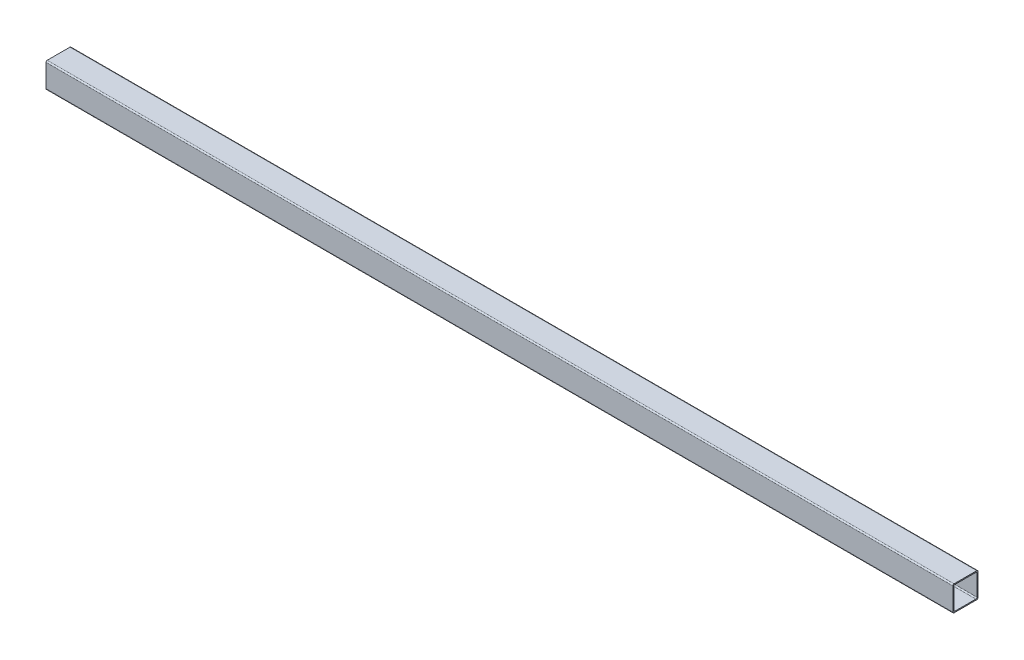
ISO-10303-21;
HEADER;
FILE_DESCRIPTION(('STEP AP214'),'2;1');
FILE_NAME('part.step','',(''),(''),'','','');
FILE_SCHEMA(('AUTOMOTIVE_DESIGN { 1 0 10303 214 1 1 1 1 }'));
ENDSEC;
DATA;
#1=APPLICATION_CONTEXT('core data for automotive mechanical design processes');
#2=APPLICATION_PROTOCOL_DEFINITION('international standard','automotive_design',2000,#1);
#3=PRODUCT_CONTEXT('',#1,'mechanical');
#4=PRODUCT('Part','Part','',(#3));
#5=PRODUCT_RELATED_PRODUCT_CATEGORY('part','',(#4));
#6=PRODUCT_DEFINITION_FORMATION('','',#4);
#7=PRODUCT_DEFINITION_CONTEXT('part definition',#1,'design');
#8=PRODUCT_DEFINITION('design','',#6,#7);
#9=PRODUCT_DEFINITION_SHAPE('','',#8);
#10=(LENGTH_UNIT() NAMED_UNIT(*) SI_UNIT(.MILLI.,.METRE.));
#11=(NAMED_UNIT(*) PLANE_ANGLE_UNIT() SI_UNIT($,.RADIAN.));
#12=(NAMED_UNIT(*) SI_UNIT($,.STERADIAN.) SOLID_ANGLE_UNIT());
#13=UNCERTAINTY_MEASURE_WITH_UNIT(LENGTH_MEASURE(1.E-05),#10,'distance_accuracy_value','');
#14=(GEOMETRIC_REPRESENTATION_CONTEXT(3) GLOBAL_UNCERTAINTY_ASSIGNED_CONTEXT((#13)) GLOBAL_UNIT_ASSIGNED_CONTEXT((#10,
#11,#12)) REPRESENTATION_CONTEXT('',''));
#15=CARTESIAN_POINT('',(0.,0.,0.));
#16=DIRECTION('',(0.,0.,1.));
#17=DIRECTION('',(1.,0.,0.));
#18=AXIS2_PLACEMENT_3D('',#15,#16,#17);
#19=CARTESIAN_POINT('',(914.4,-22.86,-22.86));
#20=DIRECTION('',(1.,0.,0.));
#21=DIRECTION('',(0.,0.,-1.));
#22=AXIS2_PLACEMENT_3D('',#19,#20,#21);
#23=PLANE('',#22);
#24=CARTESIAN_POINT('',(914.4,-22.86,-22.86));
#25=DIRECTION('',(1.,0.,0.));
#26=DIRECTION('',(0.,0.,-1.));
#27=AXIS2_PLACEMENT_3D('',#24,#25,#26);
#28=CIRCLE('',#27,2.53999999999999);
#29=CARTESIAN_POINT('',(914.4,-25.4,-22.86));
#30=VERTEX_POINT('',#29);
#31=CARTESIAN_POINT('',(914.4,-22.86,-25.4));
#32=VERTEX_POINT('',#31);
#33=EDGE_CURVE('E163',#30,#32,#28,.T.);
#34=ORIENTED_EDGE('',*,*,#33,.T.);
#35=DIRECTION('',(0.,1.,0.));
#36=VECTOR('',#35,1.);
#37=CARTESIAN_POINT('',(914.4,-22.86,-25.4));
#38=LINE('',#37,#36);
#39=CARTESIAN_POINT('',(914.4,22.86,-25.4));
#40=VERTEX_POINT('',#39);
#41=EDGE_CURVE('E246',#32,#40,#38,.T.);
#42=ORIENTED_EDGE('',*,*,#41,.T.);
#43=CARTESIAN_POINT('',(914.4,22.86,-22.86));
#44=DIRECTION('',(1.,0.,0.));
#45=DIRECTION('',(0.,0.,-1.));
#46=AXIS2_PLACEMENT_3D('',#43,#44,#45);
#47=CIRCLE('',#46,2.54);
#48=CARTESIAN_POINT('',(914.4,25.4,-22.86));
#49=VERTEX_POINT('',#48);
#50=EDGE_CURVE('E248',#40,#49,#47,.T.);
#51=ORIENTED_EDGE('',*,*,#50,.T.);
#52=DIRECTION('',(0.,0.,1.));
#53=VECTOR('',#52,1.);
#54=CARTESIAN_POINT('',(914.4,25.4,-22.86));
#55=LINE('',#54,#53);
#56=CARTESIAN_POINT('',(914.4,25.4,22.86));
#57=VERTEX_POINT('',#56);
#58=EDGE_CURVE('E250',#49,#57,#55,.T.);
#59=ORIENTED_EDGE('',*,*,#58,.T.);
#60=CARTESIAN_POINT('',(914.4,22.86,22.86));
#61=DIRECTION('',(1.,0.,0.));
#62=DIRECTION('',(0.,0.,-1.));
#63=AXIS2_PLACEMENT_3D('',#60,#61,#62);
#64=CIRCLE('',#63,2.54);
#65=CARTESIAN_POINT('',(914.4,22.86,25.4));
#66=VERTEX_POINT('',#65);
#67=EDGE_CURVE('E252',#57,#66,#64,.T.);
#68=ORIENTED_EDGE('',*,*,#67,.T.);
#69=DIRECTION('',(0.,-1.,0.));
#70=VECTOR('',#69,1.);
#71=CARTESIAN_POINT('',(914.4,-22.86,25.4));
#72=LINE('',#71,#70);
#73=CARTESIAN_POINT('',(914.4,-22.86,25.4));
#74=VERTEX_POINT('',#73);
#75=EDGE_CURVE('E254',#66,#74,#72,.T.);
#76=ORIENTED_EDGE('',*,*,#75,.T.);
#77=CARTESIAN_POINT('',(914.4,-22.86,22.86));
#78=DIRECTION('',(1.,0.,0.));
#79=DIRECTION('',(0.,0.,-1.));
#80=AXIS2_PLACEMENT_3D('',#77,#78,#79);
#81=CIRCLE('',#80,2.54000000000001);
#82=CARTESIAN_POINT('',(914.4,-25.4,22.86));
#83=VERTEX_POINT('',#82);
#84=EDGE_CURVE('E256',#74,#83,#81,.T.);
#85=ORIENTED_EDGE('',*,*,#84,.T.);
#86=DIRECTION('',(0.,0.,-1.));
#87=VECTOR('',#86,1.);
#88=CARTESIAN_POINT('',(914.4,-25.4,-22.86));
#89=LINE('',#88,#87);
#90=EDGE_CURVE('E62',#83,#30,#89,.T.);
#91=ORIENTED_EDGE('',*,*,#90,.T.);
#92=EDGE_LOOP('',(#34,#42,#51,#59,#68,#76,#85,#91));
#93=FACE_BOUND('',#92,.T.);
#94=DIRECTION('',(0.,0.,1.));
#95=VECTOR('',#94,1.);
#96=CARTESIAN_POINT('',(914.4,23.2918,-20.96262));
#97=LINE('',#96,#95);
#98=CARTESIAN_POINT('',(914.4,23.2918,-20.96262));
#99=VERTEX_POINT('',#98);
#100=CARTESIAN_POINT('',(914.4,23.2918,20.96262));
#101=VERTEX_POINT('',#100);
#102=EDGE_CURVE('E219',#99,#101,#97,.T.);
#103=ORIENTED_EDGE('',*,*,#102,.F.);
#104=CARTESIAN_POINT('',(914.4,20.96262,-20.96262));
#105=DIRECTION('',(1.,0.,0.));
#106=DIRECTION('',(0.,0.,-1.));
#107=AXIS2_PLACEMENT_3D('',#104,#105,#106);
#108=CIRCLE('',#107,2.32918);
#109=CARTESIAN_POINT('',(914.4,20.96262,-23.2918));
#110=VERTEX_POINT('',#109);
#111=EDGE_CURVE('E160',#110,#99,#108,.T.);
#112=ORIENTED_EDGE('',*,*,#111,.F.);
#113=DIRECTION('',(0.,1.,0.));
#114=VECTOR('',#113,1.);
#115=CARTESIAN_POINT('',(914.4,20.96262,-23.2918));
#116=LINE('',#115,#114);
#117=CARTESIAN_POINT('',(914.4,-20.96262,-23.2918));
#118=VERTEX_POINT('',#117);
#119=EDGE_CURVE('E231',#118,#110,#116,.T.);
#120=ORIENTED_EDGE('',*,*,#119,.F.);
#121=CARTESIAN_POINT('',(914.4,-20.96262,-20.96262));
#122=DIRECTION('',(1.,0.,0.));
#123=DIRECTION('',(0.,0.,-1.));
#124=AXIS2_PLACEMENT_3D('',#121,#122,#123);
#125=CIRCLE('',#124,2.32918000000001);
#126=CARTESIAN_POINT('',(914.4,-23.2918,-20.96262));
#127=VERTEX_POINT('',#126);
#128=EDGE_CURVE('E229',#127,#118,#125,.T.);
#129=ORIENTED_EDGE('',*,*,#128,.F.);
#130=DIRECTION('',(0.,0.,-1.));
#131=VECTOR('',#130,1.);
#132=CARTESIAN_POINT('',(914.4,-23.2918,-20.96262));
#133=LINE('',#132,#131);
#134=CARTESIAN_POINT('',(914.4,-23.2918,20.96262));
#135=VERTEX_POINT('',#134);
#136=EDGE_CURVE('E227',#135,#127,#133,.T.);
#137=ORIENTED_EDGE('',*,*,#136,.F.);
#138=CARTESIAN_POINT('',(914.4,-20.96262,20.96262));
#139=DIRECTION('',(1.,0.,0.));
#140=DIRECTION('',(0.,0.,-1.));
#141=AXIS2_PLACEMENT_3D('',#138,#139,#140);
#142=CIRCLE('',#141,2.32918);
#143=CARTESIAN_POINT('',(914.4,-20.96262,23.2918));
#144=VERTEX_POINT('',#143);
#145=EDGE_CURVE('E225',#144,#135,#142,.T.);
#146=ORIENTED_EDGE('',*,*,#145,.F.);
#147=DIRECTION('',(0.,-1.,0.));
#148=VECTOR('',#147,1.);
#149=CARTESIAN_POINT('',(914.4,20.96262,23.2918));
#150=LINE('',#149,#148);
#151=CARTESIAN_POINT('',(914.4,20.96262,23.2918));
#152=VERTEX_POINT('',#151);
#153=EDGE_CURVE('E223',#152,#144,#150,.T.);
#154=ORIENTED_EDGE('',*,*,#153,.F.);
#155=CARTESIAN_POINT('',(914.4,20.96262,20.96262));
#156=DIRECTION('',(1.,0.,0.));
#157=DIRECTION('',(0.,0.,-1.));
#158=AXIS2_PLACEMENT_3D('',#155,#156,#157);
#159=CIRCLE('',#158,2.32918000000002);
#160=EDGE_CURVE('E221',#101,#152,#159,.T.);
#161=ORIENTED_EDGE('',*,*,#160,.F.);
#162=EDGE_LOOP('',(#103,#112,#120,#129,#137,#146,#154,#161));
#163=FACE_BOUND('',#162,.T.);
#164=ADVANCED_FACE('F39',(#93,#163),#23,.T.);
#165=CARTESIAN_POINT('',(914.4,-22.86,-22.86));
#166=DIRECTION('',(-1.,0.,0.));
#167=DIRECTION('',(0.,0.,1.));
#168=AXIS2_PLACEMENT_3D('',#165,#166,#167);
#169=CYLINDRICAL_SURFACE('',#168,2.53999999999999);
#170=DIRECTION('',(-1.,0.,0.));
#171=VECTOR('',#170,1.);
#172=CARTESIAN_POINT('',(914.4,-25.4,-22.86));
#173=LINE('',#172,#171);
#174=CARTESIAN_POINT('',(-914.4,-25.4,-22.86));
#175=VERTEX_POINT('',#174);
#176=EDGE_CURVE('E259',#30,#175,#173,.T.);
#177=ORIENTED_EDGE('',*,*,#176,.T.);
#178=CARTESIAN_POINT('',(-914.4,-22.86,-22.86));
#179=DIRECTION('',(1.,0.,0.));
#180=DIRECTION('',(0.,0.,-1.));
#181=AXIS2_PLACEMENT_3D('',#178,#179,#180);
#182=CIRCLE('',#181,2.53999999999999);
#183=CARTESIAN_POINT('',(-914.4,-22.86,-25.4));
#184=VERTEX_POINT('',#183);
#185=EDGE_CURVE('E194',#175,#184,#182,.T.);
#186=ORIENTED_EDGE('',*,*,#185,.T.);
#187=DIRECTION('',(-1.,0.,0.));
#188=VECTOR('',#187,1.);
#189=CARTESIAN_POINT('',(914.4,-22.86,-25.4));
#190=LINE('',#189,#188);
#191=EDGE_CURVE('E11',#32,#184,#190,.T.);
#192=ORIENTED_EDGE('',*,*,#191,.F.);
#193=ORIENTED_EDGE('',*,*,#33,.F.);
#194=EDGE_LOOP('',(#177,#186,#192,#193));
#195=FACE_BOUND('',#194,.T.);
#196=ADVANCED_FACE('F41',(#195),#169,.T.);
#197=CARTESIAN_POINT('',(914.4,-22.86,-25.4));
#198=DIRECTION('',(0.,0.,1.));
#199=DIRECTION('',(1.,0.,0.));
#200=AXIS2_PLACEMENT_3D('',#197,#198,#199);
#201=PLANE('',#200);
#202=ORIENTED_EDGE('',*,*,#191,.T.);
#203=DIRECTION('',(0.,1.,0.));
#204=VECTOR('',#203,1.);
#205=CARTESIAN_POINT('',(-914.4,-22.86,-25.4));
#206=LINE('',#205,#204);
#207=CARTESIAN_POINT('',(-914.4,22.86,-25.4));
#208=VERTEX_POINT('',#207);
#209=EDGE_CURVE('E197',#184,#208,#206,.T.);
#210=ORIENTED_EDGE('',*,*,#209,.T.);
#211=DIRECTION('',(-1.,0.,0.));
#212=VECTOR('',#211,1.);
#213=CARTESIAN_POINT('',(914.4,22.86,-25.4));
#214=LINE('',#213,#212);
#215=EDGE_CURVE('E47',#40,#208,#214,.T.);
#216=ORIENTED_EDGE('',*,*,#215,.F.);
#217=ORIENTED_EDGE('',*,*,#41,.F.);
#218=EDGE_LOOP('',(#202,#210,#216,#217));
#219=FACE_BOUND('',#218,.T.);
#220=ADVANCED_FACE('F281',(#219),#201,.F.);
#221=CARTESIAN_POINT('',(914.4,22.86,-22.86));
#222=DIRECTION('',(-1.,0.,0.));
#223=DIRECTION('',(0.,0.,1.));
#224=AXIS2_PLACEMENT_3D('',#221,#222,#223);
#225=CYLINDRICAL_SURFACE('',#224,2.54);
#226=ORIENTED_EDGE('',*,*,#215,.T.);
#227=CARTESIAN_POINT('',(-914.4,22.86,-22.86));
#228=DIRECTION('',(1.,0.,0.));
#229=DIRECTION('',(0.,0.,-1.));
#230=AXIS2_PLACEMENT_3D('',#227,#228,#229);
#231=CIRCLE('',#230,2.54);
#232=CARTESIAN_POINT('',(-914.4,25.4,-22.86));
#233=VERTEX_POINT('',#232);
#234=EDGE_CURVE('E200',#208,#233,#231,.T.);
#235=ORIENTED_EDGE('',*,*,#234,.T.);
#236=DIRECTION('',(-1.,0.,0.));
#237=VECTOR('',#236,1.);
#238=CARTESIAN_POINT('',(914.4,25.4,-22.86));
#239=LINE('',#238,#237);
#240=EDGE_CURVE('E269',#49,#233,#239,.T.);
#241=ORIENTED_EDGE('',*,*,#240,.F.);
#242=ORIENTED_EDGE('',*,*,#50,.F.);
#243=EDGE_LOOP('',(#226,#235,#241,#242));
#244=FACE_BOUND('',#243,.T.);
#245=ADVANCED_FACE('F274',(#244),#225,.T.);
#246=CARTESIAN_POINT('',(914.4,25.4,-22.86));
#247=DIRECTION('',(0.,-1.,0.));
#248=DIRECTION('',(0.,0.,-1.));
#249=AXIS2_PLACEMENT_3D('',#246,#247,#248);
#250=PLANE('',#249);
#251=ORIENTED_EDGE('',*,*,#240,.T.);
#252=DIRECTION('',(0.,0.,1.));
#253=VECTOR('',#252,1.);
#254=CARTESIAN_POINT('',(-914.4,25.4,-22.86));
#255=LINE('',#254,#253);
#256=CARTESIAN_POINT('',(-914.4,25.4,22.86));
#257=VERTEX_POINT('',#256);
#258=EDGE_CURVE('E203',#233,#257,#255,.T.);
#259=ORIENTED_EDGE('',*,*,#258,.T.);
#260=DIRECTION('',(-1.,0.,0.));
#261=VECTOR('',#260,1.);
#262=CARTESIAN_POINT('',(914.4,25.4,22.86));
#263=LINE('',#262,#261);
#264=EDGE_CURVE('E267',#57,#257,#263,.T.);
#265=ORIENTED_EDGE('',*,*,#264,.F.);
#266=ORIENTED_EDGE('',*,*,#58,.F.);
#267=EDGE_LOOP('',(#251,#259,#265,#266));
#268=FACE_BOUND('',#267,.T.);
#269=ADVANCED_FACE('F304',(#268),#250,.F.);
#270=CARTESIAN_POINT('',(914.4,22.86,22.86));
#271=DIRECTION('',(-1.,0.,0.));
#272=DIRECTION('',(0.,0.,1.));
#273=AXIS2_PLACEMENT_3D('',#270,#271,#272);
#274=CYLINDRICAL_SURFACE('',#273,2.54);
#275=ORIENTED_EDGE('',*,*,#264,.T.);
#276=CARTESIAN_POINT('',(-914.4,22.86,22.86));
#277=DIRECTION('',(1.,0.,0.));
#278=DIRECTION('',(0.,0.,-1.));
#279=AXIS2_PLACEMENT_3D('',#276,#277,#278);
#280=CIRCLE('',#279,2.54);
#281=CARTESIAN_POINT('',(-914.4,22.86,25.4));
#282=VERTEX_POINT('',#281);
#283=EDGE_CURVE('E206',#257,#282,#280,.T.);
#284=ORIENTED_EDGE('',*,*,#283,.T.);
#285=DIRECTION('',(-1.,0.,0.));
#286=VECTOR('',#285,1.);
#287=CARTESIAN_POINT('',(914.4,22.86,25.4));
#288=LINE('',#287,#286);
#289=EDGE_CURVE('E265',#66,#282,#288,.T.);
#290=ORIENTED_EDGE('',*,*,#289,.F.);
#291=ORIENTED_EDGE('',*,*,#67,.F.);
#292=EDGE_LOOP('',(#275,#284,#290,#291));
#293=FACE_BOUND('',#292,.T.);
#294=ADVANCED_FACE('F301',(#293),#274,.T.);
#295=CARTESIAN_POINT('',(914.4,-22.86,25.4));
#296=DIRECTION('',(0.,0.,-1.));
#297=DIRECTION('',(-1.,0.,0.));
#298=AXIS2_PLACEMENT_3D('',#295,#296,#297);
#299=PLANE('',#298);
#300=ORIENTED_EDGE('',*,*,#289,.T.);
#301=DIRECTION('',(0.,-1.,0.));
#302=VECTOR('',#301,1.);
#303=CARTESIAN_POINT('',(-914.4,-22.86,25.4));
#304=LINE('',#303,#302);
#305=CARTESIAN_POINT('',(-914.4,-22.86,25.4));
#306=VERTEX_POINT('',#305);
#307=EDGE_CURVE('E209',#282,#306,#304,.T.);
#308=ORIENTED_EDGE('',*,*,#307,.T.);
#309=DIRECTION('',(-1.,0.,0.));
#310=VECTOR('',#309,1.);
#311=CARTESIAN_POINT('',(914.4,-22.86,25.4));
#312=LINE('',#311,#310);
#313=EDGE_CURVE('E263',#74,#306,#312,.T.);
#314=ORIENTED_EDGE('',*,*,#313,.F.);
#315=ORIENTED_EDGE('',*,*,#75,.F.);
#316=EDGE_LOOP('',(#300,#308,#314,#315));
#317=FACE_BOUND('',#316,.T.);
#318=ADVANCED_FACE('F296',(#317),#299,.F.);
#319=CARTESIAN_POINT('',(914.4,-22.86,22.86));
#320=DIRECTION('',(-1.,0.,0.));
#321=DIRECTION('',(0.,0.,1.));
#322=AXIS2_PLACEMENT_3D('',#319,#320,#321);
#323=CYLINDRICAL_SURFACE('',#322,2.54000000000001);
#324=ORIENTED_EDGE('',*,*,#313,.T.);
#325=CARTESIAN_POINT('',(-914.4,-22.86,22.86));
#326=DIRECTION('',(1.,0.,0.));
#327=DIRECTION('',(0.,0.,-1.));
#328=AXIS2_PLACEMENT_3D('',#325,#326,#327);
#329=CIRCLE('',#328,2.54000000000001);
#330=CARTESIAN_POINT('',(-914.4,-25.4,22.86));
#331=VERTEX_POINT('',#330);
#332=EDGE_CURVE('E212',#306,#331,#329,.T.);
#333=ORIENTED_EDGE('',*,*,#332,.T.);
#334=DIRECTION('',(-1.,0.,0.));
#335=VECTOR('',#334,1.);
#336=CARTESIAN_POINT('',(914.4,-25.4,22.86));
#337=LINE('',#336,#335);
#338=EDGE_CURVE('E261',#83,#331,#337,.T.);
#339=ORIENTED_EDGE('',*,*,#338,.F.);
#340=ORIENTED_EDGE('',*,*,#84,.F.);
#341=EDGE_LOOP('',(#324,#333,#339,#340));
#342=FACE_BOUND('',#341,.T.);
#343=ADVANCED_FACE('F292',(#342),#323,.T.);
#344=CARTESIAN_POINT('',(914.4,-25.4,-22.86));
#345=DIRECTION('',(0.,1.,0.));
#346=DIRECTION('',(0.,0.,1.));
#347=AXIS2_PLACEMENT_3D('',#344,#345,#346);
#348=PLANE('',#347);
#349=ORIENTED_EDGE('',*,*,#338,.T.);
#350=DIRECTION('',(0.,0.,-1.));
#351=VECTOR('',#350,1.);
#352=CARTESIAN_POINT('',(-914.4,-25.4,-22.86));
#353=LINE('',#352,#351);
#354=EDGE_CURVE('E215',#331,#175,#353,.T.);
#355=ORIENTED_EDGE('',*,*,#354,.T.);
#356=ORIENTED_EDGE('',*,*,#176,.F.);
#357=ORIENTED_EDGE('',*,*,#90,.F.);
#358=EDGE_LOOP('',(#349,#355,#356,#357));
#359=FACE_BOUND('',#358,.T.);
#360=ADVANCED_FACE('F288',(#359),#348,.F.);
#361=CARTESIAN_POINT('',(914.4,20.96262,-20.96262));
#362=DIRECTION('',(-1.,0.,0.));
#363=DIRECTION('',(0.,0.,1.));
#364=AXIS2_PLACEMENT_3D('',#361,#362,#363);
#365=CYLINDRICAL_SURFACE('',#364,2.32918);
#366=DIRECTION('',(-1.,0.,0.));
#367=VECTOR('',#366,1.);
#368=CARTESIAN_POINT('',(914.4,23.2918,-20.96262));
#369=LINE('',#368,#367);
#370=CARTESIAN_POINT('',(-914.4,23.2918,-20.96262));
#371=VERTEX_POINT('',#370);
#372=EDGE_CURVE('E152',#99,#371,#369,.T.);
#373=ORIENTED_EDGE('',*,*,#372,.T.);
#374=CARTESIAN_POINT('',(-914.4,20.96262,-20.96262));
#375=DIRECTION('',(1.,0.,0.));
#376=DIRECTION('',(0.,0.,-1.));
#377=AXIS2_PLACEMENT_3D('',#374,#375,#376);
#378=CIRCLE('',#377,2.32918);
#379=CARTESIAN_POINT('',(-914.4,20.96262,-23.2918));
#380=VERTEX_POINT('',#379);
#381=EDGE_CURVE('E157',#380,#371,#378,.T.);
#382=ORIENTED_EDGE('',*,*,#381,.F.);
#383=DIRECTION('',(-1.,0.,0.));
#384=VECTOR('',#383,1.);
#385=CARTESIAN_POINT('',(914.4,20.96262,-23.2918));
#386=LINE('',#385,#384);
#387=EDGE_CURVE('E233',#110,#380,#386,.T.);
#388=ORIENTED_EDGE('',*,*,#387,.F.);
#389=ORIENTED_EDGE('',*,*,#111,.T.);
#390=EDGE_LOOP('',(#373,#382,#388,#389));
#391=FACE_BOUND('',#390,.T.);
#392=ADVANCED_FACE('F154',(#391),#365,.F.);
#393=CARTESIAN_POINT('',(914.4,23.2918,-20.96262));
#394=DIRECTION('',(0.,-1.,0.));
#395=DIRECTION('',(0.,0.,-1.));
#396=AXIS2_PLACEMENT_3D('',#393,#394,#395);
#397=PLANE('',#396);
#398=DIRECTION('',(-1.,0.,0.));
#399=VECTOR('',#398,1.);
#400=CARTESIAN_POINT('',(914.4,23.2918,20.96262));
#401=LINE('',#400,#399);
#402=CARTESIAN_POINT('',(-914.4,23.2918,20.96262));
#403=VERTEX_POINT('',#402);
#404=EDGE_CURVE('E164',#101,#403,#401,.T.);
#405=ORIENTED_EDGE('',*,*,#404,.T.);
#406=DIRECTION('',(0.,0.,1.));
#407=VECTOR('',#406,1.);
#408=CARTESIAN_POINT('',(-914.4,23.2918,-20.96262));
#409=LINE('',#408,#407);
#410=EDGE_CURVE('E167',#371,#403,#409,.T.);
#411=ORIENTED_EDGE('',*,*,#410,.F.);
#412=ORIENTED_EDGE('',*,*,#372,.F.);
#413=ORIENTED_EDGE('',*,*,#102,.T.);
#414=EDGE_LOOP('',(#405,#411,#412,#413));
#415=FACE_BOUND('',#414,.T.);
#416=ADVANCED_FACE('F168',(#415),#397,.T.);
#417=CARTESIAN_POINT('',(914.4,20.96262,20.96262));
#418=DIRECTION('',(-1.,0.,0.));
#419=DIRECTION('',(0.,0.,1.));
#420=AXIS2_PLACEMENT_3D('',#417,#418,#419);
#421=CYLINDRICAL_SURFACE('',#420,2.32918000000002);
#422=DIRECTION('',(-1.,0.,0.));
#423=VECTOR('',#422,1.);
#424=CARTESIAN_POINT('',(914.4,20.96262,23.2918));
#425=LINE('',#424,#423);
#426=CARTESIAN_POINT('',(-914.4,20.96262,23.2918));
#427=VERTEX_POINT('',#426);
#428=EDGE_CURVE('E242',#152,#427,#425,.T.);
#429=ORIENTED_EDGE('',*,*,#428,.T.);
#430=CARTESIAN_POINT('',(-914.4,20.96262,20.96262));
#431=DIRECTION('',(1.,0.,0.));
#432=DIRECTION('',(0.,0.,-1.));
#433=AXIS2_PLACEMENT_3D('',#430,#431,#432);
#434=CIRCLE('',#433,2.32918000000002);
#435=EDGE_CURVE('E173',#403,#427,#434,.T.);
#436=ORIENTED_EDGE('',*,*,#435,.F.);
#437=ORIENTED_EDGE('',*,*,#404,.F.);
#438=ORIENTED_EDGE('',*,*,#160,.T.);
#439=EDGE_LOOP('',(#429,#436,#437,#438));
#440=FACE_BOUND('',#439,.T.);
#441=ADVANCED_FACE('F313',(#440),#421,.F.);
#442=CARTESIAN_POINT('',(914.4,20.96262,23.2918));
#443=DIRECTION('',(0.,0.,-1.));
#444=DIRECTION('',(0.,1.,0.));
#445=AXIS2_PLACEMENT_3D('',#442,#443,#444);
#446=PLANE('',#445);
#447=DIRECTION('',(-1.,0.,0.));
#448=VECTOR('',#447,1.);
#449=CARTESIAN_POINT('',(914.4,-20.96262,23.2918));
#450=LINE('',#449,#448);
#451=CARTESIAN_POINT('',(-914.4,-20.96262,23.2918));
#452=VERTEX_POINT('',#451);
#453=EDGE_CURVE('E240',#144,#452,#450,.T.);
#454=ORIENTED_EDGE('',*,*,#453,.T.);
#455=DIRECTION('',(0.,-1.,0.));
#456=VECTOR('',#455,1.);
#457=CARTESIAN_POINT('',(-914.4,20.96262,23.2918));
#458=LINE('',#457,#456);
#459=EDGE_CURVE('E182',#427,#452,#458,.T.);
#460=ORIENTED_EDGE('',*,*,#459,.F.);
#461=ORIENTED_EDGE('',*,*,#428,.F.);
#462=ORIENTED_EDGE('',*,*,#153,.T.);
#463=EDGE_LOOP('',(#454,#460,#461,#462));
#464=FACE_BOUND('',#463,.T.);
#465=ADVANCED_FACE('F318',(#464),#446,.T.);
#466=CARTESIAN_POINT('',(914.4,-20.96262,20.96262));
#467=DIRECTION('',(-1.,0.,0.));
#468=DIRECTION('',(0.,0.,1.));
#469=AXIS2_PLACEMENT_3D('',#466,#467,#468);
#470=CYLINDRICAL_SURFACE('',#469,2.32918);
#471=DIRECTION('',(-1.,0.,0.));
#472=VECTOR('',#471,1.);
#473=CARTESIAN_POINT('',(914.4,-23.2918,20.96262));
#474=LINE('',#473,#472);
#475=CARTESIAN_POINT('',(-914.4,-23.2918,20.96262));
#476=VERTEX_POINT('',#475);
#477=EDGE_CURVE('E238',#135,#476,#474,.T.);
#478=ORIENTED_EDGE('',*,*,#477,.T.);
#479=CARTESIAN_POINT('',(-914.4,-20.96262,20.96262));
#480=DIRECTION('',(1.,0.,0.));
#481=DIRECTION('',(0.,0.,-1.));
#482=AXIS2_PLACEMENT_3D('',#479,#480,#481);
#483=CIRCLE('',#482,2.32918);
#484=EDGE_CURVE('E185',#452,#476,#483,.T.);
#485=ORIENTED_EDGE('',*,*,#484,.F.);
#486=ORIENTED_EDGE('',*,*,#453,.F.);
#487=ORIENTED_EDGE('',*,*,#145,.T.);
#488=EDGE_LOOP('',(#478,#485,#486,#487));
#489=FACE_BOUND('',#488,.T.);
#490=ADVANCED_FACE('F322',(#489),#470,.F.);
#491=CARTESIAN_POINT('',(914.4,-23.2918,-20.96262));
#492=DIRECTION('',(0.,1.,0.));
#493=DIRECTION('',(0.,0.,1.));
#494=AXIS2_PLACEMENT_3D('',#491,#492,#493);
#495=PLANE('',#494);
#496=DIRECTION('',(-1.,0.,0.));
#497=VECTOR('',#496,1.);
#498=CARTESIAN_POINT('',(914.4,-23.2918,-20.96262));
#499=LINE('',#498,#497);
#500=CARTESIAN_POINT('',(-914.4,-23.2918,-20.96262));
#501=VERTEX_POINT('',#500);
#502=EDGE_CURVE('E236',#127,#501,#499,.T.);
#503=ORIENTED_EDGE('',*,*,#502,.T.);
#504=DIRECTION('',(0.,0.,-1.));
#505=VECTOR('',#504,1.);
#506=CARTESIAN_POINT('',(-914.4,-23.2918,-20.96262));
#507=LINE('',#506,#505);
#508=EDGE_CURVE('E188',#476,#501,#507,.T.);
#509=ORIENTED_EDGE('',*,*,#508,.F.);
#510=ORIENTED_EDGE('',*,*,#477,.F.);
#511=ORIENTED_EDGE('',*,*,#136,.T.);
#512=EDGE_LOOP('',(#503,#509,#510,#511));
#513=FACE_BOUND('',#512,.T.);
#514=ADVANCED_FACE('F327',(#513),#495,.T.);
#515=CARTESIAN_POINT('',(914.4,-20.96262,-20.96262));
#516=DIRECTION('',(-1.,0.,0.));
#517=DIRECTION('',(0.,0.,1.));
#518=AXIS2_PLACEMENT_3D('',#515,#516,#517);
#519=CYLINDRICAL_SURFACE('',#518,2.32918000000001);
#520=DIRECTION('',(-1.,0.,0.));
#521=VECTOR('',#520,1.);
#522=CARTESIAN_POINT('',(914.4,-20.96262,-23.2918));
#523=LINE('',#522,#521);
#524=CARTESIAN_POINT('',(-914.4,-20.96262,-23.2918));
#525=VERTEX_POINT('',#524);
#526=EDGE_CURVE('E54',#118,#525,#523,.T.);
#527=ORIENTED_EDGE('',*,*,#526,.T.);
#528=CARTESIAN_POINT('',(-914.4,-20.96262,-20.96262));
#529=DIRECTION('',(1.,0.,0.));
#530=DIRECTION('',(0.,0.,-1.));
#531=AXIS2_PLACEMENT_3D('',#528,#529,#530);
#532=CIRCLE('',#531,2.32918000000001);
#533=EDGE_CURVE('E191',#501,#525,#532,.T.);
#534=ORIENTED_EDGE('',*,*,#533,.F.);
#535=ORIENTED_EDGE('',*,*,#502,.F.);
#536=ORIENTED_EDGE('',*,*,#128,.T.);
#537=EDGE_LOOP('',(#527,#534,#535,#536));
#538=FACE_BOUND('',#537,.T.);
#539=ADVANCED_FACE('F331',(#538),#519,.F.);
#540=CARTESIAN_POINT('',(914.4,20.96262,-23.2918));
#541=DIRECTION('',(0.,0.,1.));
#542=DIRECTION('',(1.,0.,0.));
#543=AXIS2_PLACEMENT_3D('',#540,#541,#542);
#544=PLANE('',#543);
#545=ORIENTED_EDGE('',*,*,#387,.T.);
#546=DIRECTION('',(0.,1.,0.));
#547=VECTOR('',#546,1.);
#548=CARTESIAN_POINT('',(-914.4,20.96262,-23.2918));
#549=LINE('',#548,#547);
#550=EDGE_CURVE('E178',#525,#380,#549,.T.);
#551=ORIENTED_EDGE('',*,*,#550,.F.);
#552=ORIENTED_EDGE('',*,*,#526,.F.);
#553=ORIENTED_EDGE('',*,*,#119,.T.);
#554=EDGE_LOOP('',(#545,#551,#552,#553));
#555=FACE_BOUND('',#554,.T.);
#556=ADVANCED_FACE('F333',(#555),#544,.T.);
#557=CARTESIAN_POINT('',(-914.4,-22.86,-22.86));
#558=DIRECTION('',(1.,0.,0.));
#559=DIRECTION('',(0.,0.,-1.));
#560=AXIS2_PLACEMENT_3D('',#557,#558,#559);
#561=PLANE('',#560);
#562=ORIENTED_EDGE('',*,*,#550,.T.);
#563=ORIENTED_EDGE('',*,*,#381,.T.);
#564=ORIENTED_EDGE('',*,*,#410,.T.);
#565=ORIENTED_EDGE('',*,*,#435,.T.);
#566=ORIENTED_EDGE('',*,*,#459,.T.);
#567=ORIENTED_EDGE('',*,*,#484,.T.);
#568=ORIENTED_EDGE('',*,*,#508,.T.);
#569=ORIENTED_EDGE('',*,*,#533,.T.);
#570=EDGE_LOOP('',(#562,#563,#564,#565,#566,#567,#568,#569));
#571=FACE_BOUND('',#570,.T.);
#572=ORIENTED_EDGE('',*,*,#185,.F.);
#573=ORIENTED_EDGE('',*,*,#354,.F.);
#574=ORIENTED_EDGE('',*,*,#332,.F.);
#575=ORIENTED_EDGE('',*,*,#307,.F.);
#576=ORIENTED_EDGE('',*,*,#283,.F.);
#577=ORIENTED_EDGE('',*,*,#258,.F.);
#578=ORIENTED_EDGE('',*,*,#234,.F.);
#579=ORIENTED_EDGE('',*,*,#209,.F.);
#580=EDGE_LOOP('',(#572,#573,#574,#575,#576,#577,#578,#579));
#581=FACE_BOUND('',#580,.T.);
#582=ADVANCED_FACE('F175',(#571,#581),#561,.F.);
#583=CLOSED_SHELL('',(#164,#196,#220,#245,#269,#294,#318,#343,#360,#392,#416,#441,#465,#490,
#514,#539,#556,#582));
#584=MANIFOLD_SOLID_BREP('B2',#583);
#585=ADVANCED_BREP_SHAPE_REPRESENTATION('',(#18,#584),#14);
#586=SHAPE_DEFINITION_REPRESENTATION(#9,#585);
ENDSEC;
END-ISO-10303-21;
